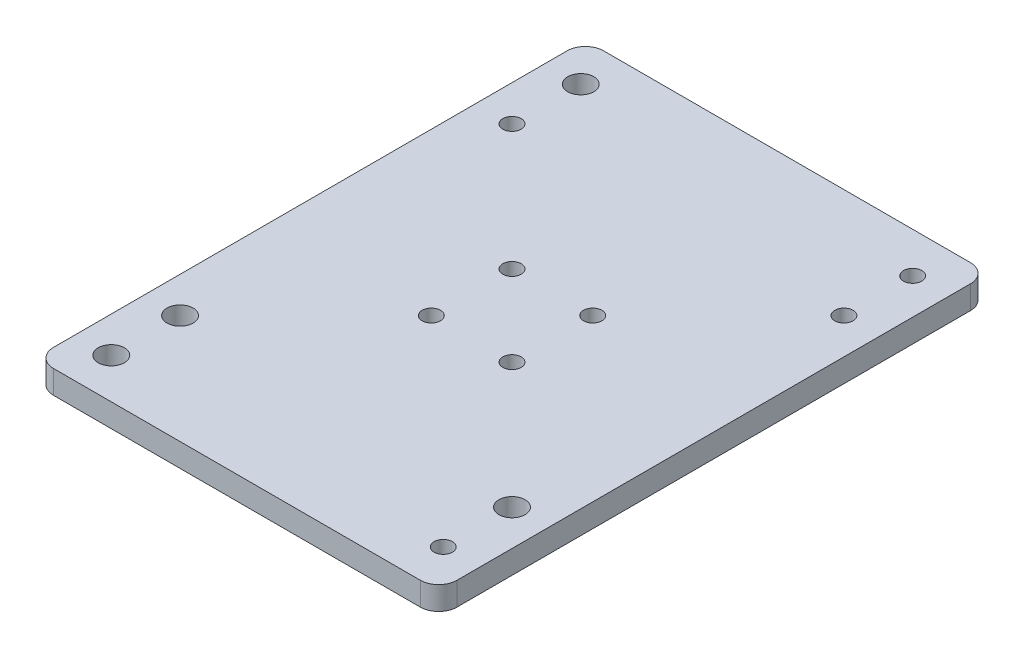
ISO-10303-21;
HEADER;
FILE_DESCRIPTION(('STEP AP214'),'2;1');
FILE_NAME('part.step','',(''),(''),'','','');
FILE_SCHEMA(('AUTOMOTIVE_DESIGN { 1 0 10303 214 1 1 1 1 }'));
ENDSEC;
DATA;
#1=APPLICATION_CONTEXT('core data for automotive mechanical design processes');
#2=APPLICATION_PROTOCOL_DEFINITION('international standard','automotive_design',2000,#1);
#3=PRODUCT_CONTEXT('',#1,'mechanical');
#4=PRODUCT('Part','Part','',(#3));
#5=PRODUCT_RELATED_PRODUCT_CATEGORY('part','',(#4));
#6=PRODUCT_DEFINITION_FORMATION('','',#4);
#7=PRODUCT_DEFINITION_CONTEXT('part definition',#1,'design');
#8=PRODUCT_DEFINITION('design','',#6,#7);
#9=PRODUCT_DEFINITION_SHAPE('','',#8);
#10=(LENGTH_UNIT() NAMED_UNIT(*) SI_UNIT(.MILLI.,.METRE.));
#11=(NAMED_UNIT(*) PLANE_ANGLE_UNIT() SI_UNIT($,.RADIAN.));
#12=(NAMED_UNIT(*) SI_UNIT($,.STERADIAN.) SOLID_ANGLE_UNIT());
#13=UNCERTAINTY_MEASURE_WITH_UNIT(LENGTH_MEASURE(1.E-05),#10,'distance_accuracy_value','');
#14=(GEOMETRIC_REPRESENTATION_CONTEXT(3) GLOBAL_UNCERTAINTY_ASSIGNED_CONTEXT((#13)) GLOBAL_UNIT_ASSIGNED_CONTEXT((#10,
#11,#12)) REPRESENTATION_CONTEXT('',''));
#15=CARTESIAN_POINT('',(0.,0.,0.));
#16=DIRECTION('',(0.,0.,1.));
#17=DIRECTION('',(1.,0.,0.));
#18=AXIS2_PLACEMENT_3D('',#15,#16,#17);
#19=CARTESIAN_POINT('',(0.,6.35,0.));
#20=DIRECTION('',(0.,1.,0.));
#21=DIRECTION('',(0.,0.,1.));
#22=AXIS2_PLACEMENT_3D('',#19,#20,#21);
#23=PLANE('',#22);
#24=CARTESIAN_POINT('',(11.,6.35,11.));
#25=DIRECTION('',(0.,1.,0.));
#26=DIRECTION('',(0.,0.,1.));
#27=AXIS2_PLACEMENT_3D('',#24,#25,#26);
#28=CIRCLE('',#27,2.5);
#29=CARTESIAN_POINT('',(11.,6.35,13.5));
#30=VERTEX_POINT('',#29);
#31=EDGE_CURVE('E228',#30,#30,#28,.T.);
#32=ORIENTED_EDGE('',*,*,#31,.F.);
#33=EDGE_LOOP('',(#32));
#34=FACE_BOUND('',#33,.T.);
#35=CARTESIAN_POINT('',(-11.,6.35,-11.));
#36=DIRECTION('',(0.,1.,0.));
#37=DIRECTION('',(0.,0.,1.));
#38=AXIS2_PLACEMENT_3D('',#35,#36,#37);
#39=CIRCLE('',#38,2.5);
#40=CARTESIAN_POINT('',(-11.,6.35,-8.49999999999998));
#41=VERTEX_POINT('',#40);
#42=EDGE_CURVE('E216',#41,#41,#39,.T.);
#43=ORIENTED_EDGE('',*,*,#42,.F.);
#44=EDGE_LOOP('',(#43));
#45=FACE_BOUND('',#44,.T.);
#46=CARTESIAN_POINT('',(-45.25,6.35,-45.2499999999999));
#47=DIRECTION('',(0.,1.,0.));
#48=DIRECTION('',(0.,0.,1.));
#49=AXIS2_PLACEMENT_3D('',#46,#47,#48);
#50=CIRCLE('',#49,2.5);
#51=CARTESIAN_POINT('',(-45.25,6.35,-42.7499999999999));
#52=VERTEX_POINT('',#51);
#53=EDGE_CURVE('E204',#52,#52,#50,.T.);
#54=ORIENTED_EDGE('',*,*,#53,.F.);
#55=EDGE_LOOP('',(#54));
#56=FACE_BOUND('',#55,.T.);
#57=CARTESIAN_POINT('',(-45.25,6.35,45.25));
#58=DIRECTION('',(0.,1.,0.));
#59=DIRECTION('',(0.,0.,1.));
#60=AXIS2_PLACEMENT_3D('',#57,#58,#59);
#61=CIRCLE('',#60,3.55999999999983);
#62=CARTESIAN_POINT('',(-45.25,6.35,48.8099999999998));
#63=VERTEX_POINT('',#62);
#64=EDGE_CURVE('E192',#63,#63,#61,.T.);
#65=ORIENTED_EDGE('',*,*,#64,.F.);
#66=EDGE_LOOP('',(#65));
#67=FACE_BOUND('',#66,.T.);
#68=CARTESIAN_POINT('',(45.25,6.35,-64.));
#69=DIRECTION('',(0.,1.,0.));
#70=DIRECTION('',(0.,0.,1.));
#71=AXIS2_PLACEMENT_3D('',#68,#69,#70);
#72=CIRCLE('',#71,2.5);
#73=CARTESIAN_POINT('',(45.25,6.35,-61.5));
#74=VERTEX_POINT('',#73);
#75=EDGE_CURVE('E180',#74,#74,#72,.T.);
#76=ORIENTED_EDGE('',*,*,#75,.F.);
#77=EDGE_LOOP('',(#76));
#78=FACE_BOUND('',#77,.T.);
#79=CARTESIAN_POINT('',(-45.25,6.35,-64.));
#80=DIRECTION('',(0.,1.,0.));
#81=DIRECTION('',(0.,0.,1.));
#82=AXIS2_PLACEMENT_3D('',#79,#80,#81);
#83=CIRCLE('',#82,3.56);
#84=CARTESIAN_POINT('',(-45.25,6.35,-60.44));
#85=VERTEX_POINT('',#84);
#86=EDGE_CURVE('E163',#85,#85,#83,.T.);
#87=ORIENTED_EDGE('',*,*,#86,.F.);
#88=EDGE_LOOP('',(#87));
#89=FACE_BOUND('',#88,.T.);
#90=DIRECTION('',(0.,0.,-1.));
#91=VECTOR('',#90,1.);
#92=CARTESIAN_POINT('',(55.,6.35,75.));
#93=LINE('',#92,#91);
#94=CARTESIAN_POINT('',(55.,6.35,70.));
#95=VERTEX_POINT('',#94);
#96=CARTESIAN_POINT('',(55.,6.35,-70.));
#97=VERTEX_POINT('',#96);
#98=EDGE_CURVE('E170',#95,#97,#93,.T.);
#99=ORIENTED_EDGE('',*,*,#98,.T.);
#100=CARTESIAN_POINT('',(50.,6.35,-70.));
#101=DIRECTION('',(0.,1.,0.));
#102=DIRECTION('',(0.,0.,1.));
#103=AXIS2_PLACEMENT_3D('',#100,#101,#102);
#104=CIRCLE('',#103,5.);
#105=CARTESIAN_POINT('',(50.,6.35,-75.));
#106=VERTEX_POINT('',#105);
#107=EDGE_CURVE('E147',#97,#106,#104,.T.);
#108=ORIENTED_EDGE('',*,*,#107,.T.);
#109=DIRECTION('',(-1.,0.,0.));
#110=VECTOR('',#109,1.);
#111=CARTESIAN_POINT('',(55.,6.35,-75.));
#112=LINE('',#111,#110);
#113=CARTESIAN_POINT('',(-50.,6.35,-75.));
#114=VERTEX_POINT('',#113);
#115=EDGE_CURVE('E118',#106,#114,#112,.T.);
#116=ORIENTED_EDGE('',*,*,#115,.T.);
#117=CARTESIAN_POINT('',(-50.,6.35,-70.));
#118=DIRECTION('',(0.,1.,0.));
#119=DIRECTION('',(0.,0.,1.));
#120=AXIS2_PLACEMENT_3D('',#117,#118,#119);
#121=CIRCLE('',#120,5.);
#122=CARTESIAN_POINT('',(-55.,6.35,-70.));
#123=VERTEX_POINT('',#122);
#124=EDGE_CURVE('E142',#114,#123,#121,.T.);
#125=ORIENTED_EDGE('',*,*,#124,.T.);
#126=DIRECTION('',(0.,0.,1.));
#127=VECTOR('',#126,1.);
#128=CARTESIAN_POINT('',(-55.,6.35,75.));
#129=LINE('',#128,#127);
#130=CARTESIAN_POINT('',(-55.,6.35,70.));
#131=VERTEX_POINT('',#130);
#132=EDGE_CURVE('E125',#123,#131,#129,.T.);
#133=ORIENTED_EDGE('',*,*,#132,.T.);
#134=CARTESIAN_POINT('',(-50.,6.35,70.));
#135=DIRECTION('',(0.,1.,0.));
#136=DIRECTION('',(0.,0.,1.));
#137=AXIS2_PLACEMENT_3D('',#134,#135,#136);
#138=CIRCLE('',#137,5.);
#139=CARTESIAN_POINT('',(-50.,6.35,75.));
#140=VERTEX_POINT('',#139);
#141=EDGE_CURVE('E54',#131,#140,#138,.T.);
#142=ORIENTED_EDGE('',*,*,#141,.T.);
#143=DIRECTION('',(1.,0.,0.));
#144=VECTOR('',#143,1.);
#145=CARTESIAN_POINT('',(55.,6.35,75.));
#146=LINE('',#145,#144);
#147=CARTESIAN_POINT('',(50.,6.35,75.));
#148=VERTEX_POINT('',#147);
#149=EDGE_CURVE('E128',#140,#148,#146,.T.);
#150=ORIENTED_EDGE('',*,*,#149,.T.);
#151=CARTESIAN_POINT('',(50.,6.35,70.));
#152=DIRECTION('',(0.,1.,0.));
#153=DIRECTION('',(0.,0.,1.));
#154=AXIS2_PLACEMENT_3D('',#151,#152,#153);
#155=CIRCLE('',#154,5.);
#156=EDGE_CURVE('E145',#148,#95,#155,.T.);
#157=ORIENTED_EDGE('',*,*,#156,.T.);
#158=EDGE_LOOP('',(#99,#108,#116,#125,#133,#142,#150,#157));
#159=FACE_BOUND('',#158,.T.);
#160=CARTESIAN_POINT('',(-45.25,6.35,64.));
#161=DIRECTION('',(0.,1.,0.));
#162=DIRECTION('',(0.,0.,1.));
#163=AXIS2_PLACEMENT_3D('',#160,#161,#162);
#164=CIRCLE('',#163,3.56);
#165=CARTESIAN_POINT('',(-45.25,6.35,67.56));
#166=VERTEX_POINT('',#165);
#167=EDGE_CURVE('E175',#166,#166,#164,.T.);
#168=ORIENTED_EDGE('',*,*,#167,.F.);
#169=EDGE_LOOP('',(#168));
#170=FACE_BOUND('',#169,.T.);
#171=CARTESIAN_POINT('',(45.25,6.35,64.));
#172=DIRECTION('',(0.,1.,0.));
#173=DIRECTION('',(0.,0.,1.));
#174=AXIS2_PLACEMENT_3D('',#171,#172,#173);
#175=CIRCLE('',#174,2.5);
#176=CARTESIAN_POINT('',(45.25,6.35,66.5));
#177=VERTEX_POINT('',#176);
#178=EDGE_CURVE('E186',#177,#177,#175,.T.);
#179=ORIENTED_EDGE('',*,*,#178,.F.);
#180=EDGE_LOOP('',(#179));
#181=FACE_BOUND('',#180,.T.);
#182=CARTESIAN_POINT('',(45.25,6.35,45.25));
#183=DIRECTION('',(0.,1.,0.));
#184=DIRECTION('',(0.,0.,1.));
#185=AXIS2_PLACEMENT_3D('',#182,#183,#184);
#186=CIRCLE('',#185,3.55999999999997);
#187=CARTESIAN_POINT('',(45.25,6.35,48.8099999999999));
#188=VERTEX_POINT('',#187);
#189=EDGE_CURVE('E198',#188,#188,#186,.T.);
#190=ORIENTED_EDGE('',*,*,#189,.F.);
#191=EDGE_LOOP('',(#190));
#192=FACE_BOUND('',#191,.T.);
#193=CARTESIAN_POINT('',(45.25,6.35,-45.2499999999999));
#194=DIRECTION('',(0.,1.,0.));
#195=DIRECTION('',(0.,0.,1.));
#196=AXIS2_PLACEMENT_3D('',#193,#194,#195);
#197=CIRCLE('',#196,2.50000000000019);
#198=CARTESIAN_POINT('',(45.25,6.35,-42.7499999999997));
#199=VERTEX_POINT('',#198);
#200=EDGE_CURVE('E210',#199,#199,#197,.T.);
#201=ORIENTED_EDGE('',*,*,#200,.F.);
#202=EDGE_LOOP('',(#201));
#203=FACE_BOUND('',#202,.T.);
#204=CARTESIAN_POINT('',(11.,6.35,-11.));
#205=DIRECTION('',(0.,1.,0.));
#206=DIRECTION('',(0.,0.,1.));
#207=AXIS2_PLACEMENT_3D('',#204,#205,#206);
#208=CIRCLE('',#207,2.5);
#209=CARTESIAN_POINT('',(11.,6.35,-8.49999999999998));
#210=VERTEX_POINT('',#209);
#211=EDGE_CURVE('E222',#210,#210,#208,.T.);
#212=ORIENTED_EDGE('',*,*,#211,.F.);
#213=EDGE_LOOP('',(#212));
#214=FACE_BOUND('',#213,.T.);
#215=CARTESIAN_POINT('',(-11.,6.35,11.));
#216=DIRECTION('',(0.,1.,0.));
#217=DIRECTION('',(0.,0.,1.));
#218=AXIS2_PLACEMENT_3D('',#215,#216,#217);
#219=CIRCLE('',#218,2.5);
#220=CARTESIAN_POINT('',(-11.,6.35,13.5));
#221=VERTEX_POINT('',#220);
#222=EDGE_CURVE('E234',#221,#221,#219,.T.);
#223=ORIENTED_EDGE('',*,*,#222,.F.);
#224=EDGE_LOOP('',(#223));
#225=FACE_BOUND('',#224,.T.);
#226=ADVANCED_FACE('F32',(#34,#45,#56,#67,#78,#89,#159,#170,#181,#192,#203,#214,#225),#23,.T.);
#227=CARTESIAN_POINT('',(0.,0.,0.));
#228=DIRECTION('',(0.,1.,0.));
#229=DIRECTION('',(0.,0.,1.));
#230=AXIS2_PLACEMENT_3D('',#227,#228,#229);
#231=PLANE('',#230);
#232=CARTESIAN_POINT('',(11.,0.,11.));
#233=DIRECTION('',(0.,1.,0.));
#234=DIRECTION('',(0.,0.,1.));
#235=AXIS2_PLACEMENT_3D('',#232,#233,#234);
#236=CIRCLE('',#235,2.5);
#237=CARTESIAN_POINT('',(11.,0.,13.5));
#238=VERTEX_POINT('',#237);
#239=EDGE_CURVE('E231',#238,#238,#236,.T.);
#240=ORIENTED_EDGE('',*,*,#239,.T.);
#241=EDGE_LOOP('',(#240));
#242=FACE_BOUND('',#241,.T.);
#243=CARTESIAN_POINT('',(-11.,0.,-11.));
#244=DIRECTION('',(0.,1.,0.));
#245=DIRECTION('',(0.,0.,1.));
#246=AXIS2_PLACEMENT_3D('',#243,#244,#245);
#247=CIRCLE('',#246,2.5);
#248=CARTESIAN_POINT('',(-11.,0.,-8.49999999999998));
#249=VERTEX_POINT('',#248);
#250=EDGE_CURVE('E219',#249,#249,#247,.T.);
#251=ORIENTED_EDGE('',*,*,#250,.T.);
#252=EDGE_LOOP('',(#251));
#253=FACE_BOUND('',#252,.T.);
#254=CARTESIAN_POINT('',(-45.25,0.,-45.2499999999999));
#255=DIRECTION('',(0.,1.,0.));
#256=DIRECTION('',(0.,0.,1.));
#257=AXIS2_PLACEMENT_3D('',#254,#255,#256);
#258=CIRCLE('',#257,2.5);
#259=CARTESIAN_POINT('',(-45.25,0.,-42.7499999999999));
#260=VERTEX_POINT('',#259);
#261=EDGE_CURVE('E207',#260,#260,#258,.T.);
#262=ORIENTED_EDGE('',*,*,#261,.T.);
#263=EDGE_LOOP('',(#262));
#264=FACE_BOUND('',#263,.T.);
#265=CARTESIAN_POINT('',(-45.25,0.,45.25));
#266=DIRECTION('',(0.,1.,0.));
#267=DIRECTION('',(0.,0.,1.));
#268=AXIS2_PLACEMENT_3D('',#265,#266,#267);
#269=CIRCLE('',#268,3.55999999999983);
#270=CARTESIAN_POINT('',(-45.25,0.,48.8099999999998));
#271=VERTEX_POINT('',#270);
#272=EDGE_CURVE('E195',#271,#271,#269,.T.);
#273=ORIENTED_EDGE('',*,*,#272,.T.);
#274=EDGE_LOOP('',(#273));
#275=FACE_BOUND('',#274,.T.);
#276=CARTESIAN_POINT('',(45.25,0.,-64.));
#277=DIRECTION('',(0.,1.,0.));
#278=DIRECTION('',(0.,0.,1.));
#279=AXIS2_PLACEMENT_3D('',#276,#277,#278);
#280=CIRCLE('',#279,2.5);
#281=CARTESIAN_POINT('',(45.25,0.,-61.5));
#282=VERTEX_POINT('',#281);
#283=EDGE_CURVE('E183',#282,#282,#280,.T.);
#284=ORIENTED_EDGE('',*,*,#283,.T.);
#285=EDGE_LOOP('',(#284));
#286=FACE_BOUND('',#285,.T.);
#287=CARTESIAN_POINT('',(-45.25,0.,-64.));
#288=DIRECTION('',(0.,1.,0.));
#289=DIRECTION('',(0.,0.,1.));
#290=AXIS2_PLACEMENT_3D('',#287,#288,#289);
#291=CIRCLE('',#290,3.56);
#292=CARTESIAN_POINT('',(-45.25,0.,-60.44));
#293=VERTEX_POINT('',#292);
#294=EDGE_CURVE('E166',#293,#293,#291,.T.);
#295=ORIENTED_EDGE('',*,*,#294,.T.);
#296=EDGE_LOOP('',(#295));
#297=FACE_BOUND('',#296,.T.);
#298=DIRECTION('',(-1.,0.,0.));
#299=VECTOR('',#298,1.);
#300=CARTESIAN_POINT('',(55.,0.,-75.));
#301=LINE('',#300,#299);
#302=CARTESIAN_POINT('',(50.,0.,-75.));
#303=VERTEX_POINT('',#302);
#304=CARTESIAN_POINT('',(-50.,0.,-75.));
#305=VERTEX_POINT('',#304);
#306=EDGE_CURVE('E115',#303,#305,#301,.T.);
#307=ORIENTED_EDGE('',*,*,#306,.F.);
#308=CARTESIAN_POINT('',(50.,0.,-70.));
#309=DIRECTION('',(0.,1.,0.));
#310=DIRECTION('',(0.,0.,1.));
#311=AXIS2_PLACEMENT_3D('',#308,#309,#310);
#312=CIRCLE('',#311,5.);
#313=CARTESIAN_POINT('',(55.,0.,-70.));
#314=VERTEX_POINT('',#313);
#315=EDGE_CURVE('E98',#303,#314,#312,.F.);
#316=ORIENTED_EDGE('',*,*,#315,.T.);
#317=DIRECTION('',(0.,0.,-1.));
#318=VECTOR('',#317,1.);
#319=CARTESIAN_POINT('',(55.,0.,75.));
#320=LINE('',#319,#318);
#321=CARTESIAN_POINT('',(55.,0.,70.));
#322=VERTEX_POINT('',#321);
#323=EDGE_CURVE('E126',#322,#314,#320,.T.);
#324=ORIENTED_EDGE('',*,*,#323,.F.);
#325=CARTESIAN_POINT('',(50.,0.,70.));
#326=DIRECTION('',(0.,1.,0.));
#327=DIRECTION('',(0.,0.,1.));
#328=AXIS2_PLACEMENT_3D('',#325,#326,#327);
#329=CIRCLE('',#328,5.);
#330=CARTESIAN_POINT('',(50.,0.,75.));
#331=VERTEX_POINT('',#330);
#332=EDGE_CURVE('E109',#322,#331,#329,.F.);
#333=ORIENTED_EDGE('',*,*,#332,.T.);
#334=DIRECTION('',(1.,0.,0.));
#335=VECTOR('',#334,1.);
#336=CARTESIAN_POINT('',(55.,0.,75.));
#337=LINE('',#336,#335);
#338=CARTESIAN_POINT('',(-50.,0.,75.));
#339=VERTEX_POINT('',#338);
#340=EDGE_CURVE('E130',#339,#331,#337,.T.);
#341=ORIENTED_EDGE('',*,*,#340,.F.);
#342=CARTESIAN_POINT('',(-50.,0.,70.));
#343=DIRECTION('',(0.,1.,0.));
#344=DIRECTION('',(0.,0.,1.));
#345=AXIS2_PLACEMENT_3D('',#342,#343,#344);
#346=CIRCLE('',#345,5.);
#347=CARTESIAN_POINT('',(-55.,0.,70.));
#348=VERTEX_POINT('',#347);
#349=EDGE_CURVE('E136',#339,#348,#346,.F.);
#350=ORIENTED_EDGE('',*,*,#349,.T.);
#351=DIRECTION('',(0.,0.,1.));
#352=VECTOR('',#351,1.);
#353=CARTESIAN_POINT('',(-55.,0.,75.));
#354=LINE('',#353,#352);
#355=CARTESIAN_POINT('',(-55.,0.,-70.));
#356=VERTEX_POINT('',#355);
#357=EDGE_CURVE('E158',#356,#348,#354,.T.);
#358=ORIENTED_EDGE('',*,*,#357,.F.);
#359=CARTESIAN_POINT('',(-50.,0.,-70.));
#360=DIRECTION('',(0.,1.,0.));
#361=DIRECTION('',(0.,0.,1.));
#362=AXIS2_PLACEMENT_3D('',#359,#360,#361);
#363=CIRCLE('',#362,5.);
#364=EDGE_CURVE('E119',#356,#305,#363,.F.);
#365=ORIENTED_EDGE('',*,*,#364,.T.);
#366=EDGE_LOOP('',(#307,#316,#324,#333,#341,#350,#358,#365));
#367=FACE_BOUND('',#366,.T.);
#368=CARTESIAN_POINT('',(-45.25,0.,64.));
#369=DIRECTION('',(0.,1.,0.));
#370=DIRECTION('',(0.,0.,1.));
#371=AXIS2_PLACEMENT_3D('',#368,#369,#370);
#372=CIRCLE('',#371,3.56);
#373=CARTESIAN_POINT('',(-45.25,0.,67.56));
#374=VERTEX_POINT('',#373);
#375=EDGE_CURVE('E177',#374,#374,#372,.T.);
#376=ORIENTED_EDGE('',*,*,#375,.T.);
#377=EDGE_LOOP('',(#376));
#378=FACE_BOUND('',#377,.T.);
#379=CARTESIAN_POINT('',(45.25,0.,64.));
#380=DIRECTION('',(0.,1.,0.));
#381=DIRECTION('',(0.,0.,1.));
#382=AXIS2_PLACEMENT_3D('',#379,#380,#381);
#383=CIRCLE('',#382,2.5);
#384=CARTESIAN_POINT('',(45.25,0.,66.5));
#385=VERTEX_POINT('',#384);
#386=EDGE_CURVE('E189',#385,#385,#383,.T.);
#387=ORIENTED_EDGE('',*,*,#386,.T.);
#388=EDGE_LOOP('',(#387));
#389=FACE_BOUND('',#388,.T.);
#390=CARTESIAN_POINT('',(45.25,0.,45.25));
#391=DIRECTION('',(0.,1.,0.));
#392=DIRECTION('',(0.,0.,1.));
#393=AXIS2_PLACEMENT_3D('',#390,#391,#392);
#394=CIRCLE('',#393,3.55999999999997);
#395=CARTESIAN_POINT('',(45.25,0.,48.8099999999999));
#396=VERTEX_POINT('',#395);
#397=EDGE_CURVE('E201',#396,#396,#394,.T.);
#398=ORIENTED_EDGE('',*,*,#397,.T.);
#399=EDGE_LOOP('',(#398));
#400=FACE_BOUND('',#399,.T.);
#401=CARTESIAN_POINT('',(45.25,0.,-45.2499999999999));
#402=DIRECTION('',(0.,1.,0.));
#403=DIRECTION('',(0.,0.,1.));
#404=AXIS2_PLACEMENT_3D('',#401,#402,#403);
#405=CIRCLE('',#404,2.50000000000019);
#406=CARTESIAN_POINT('',(45.25,0.,-42.7499999999997));
#407=VERTEX_POINT('',#406);
#408=EDGE_CURVE('E213',#407,#407,#405,.T.);
#409=ORIENTED_EDGE('',*,*,#408,.T.);
#410=EDGE_LOOP('',(#409));
#411=FACE_BOUND('',#410,.T.);
#412=CARTESIAN_POINT('',(11.,0.,-11.));
#413=DIRECTION('',(0.,1.,0.));
#414=DIRECTION('',(0.,0.,1.));
#415=AXIS2_PLACEMENT_3D('',#412,#413,#414);
#416=CIRCLE('',#415,2.5);
#417=CARTESIAN_POINT('',(11.,0.,-8.49999999999998));
#418=VERTEX_POINT('',#417);
#419=EDGE_CURVE('E225',#418,#418,#416,.T.);
#420=ORIENTED_EDGE('',*,*,#419,.T.);
#421=EDGE_LOOP('',(#420));
#422=FACE_BOUND('',#421,.T.);
#423=CARTESIAN_POINT('',(-11.,0.,11.));
#424=DIRECTION('',(0.,1.,0.));
#425=DIRECTION('',(0.,0.,1.));
#426=AXIS2_PLACEMENT_3D('',#423,#424,#425);
#427=CIRCLE('',#426,2.5);
#428=CARTESIAN_POINT('',(-11.,0.,13.5));
#429=VERTEX_POINT('',#428);
#430=EDGE_CURVE('E237',#429,#429,#427,.T.);
#431=ORIENTED_EDGE('',*,*,#430,.T.);
#432=EDGE_LOOP('',(#431));
#433=FACE_BOUND('',#432,.T.);
#434=ADVANCED_FACE('F122',(#242,#253,#264,#275,#286,#297,#367,#378,#389,#400,#411,#422,#433),
#231,.F.);
#435=CARTESIAN_POINT('',(-55.,6.35,75.));
#436=DIRECTION('',(1.,0.,0.));
#437=DIRECTION('',(0.,0.,-1.));
#438=AXIS2_PLACEMENT_3D('',#435,#436,#437);
#439=PLANE('',#438);
#440=ORIENTED_EDGE('',*,*,#357,.T.);
#441=DIRECTION('',(0.,-1.,0.));
#442=VECTOR('',#441,1.);
#443=CARTESIAN_POINT('',(-55.,6.35,70.));
#444=LINE('',#443,#442);
#445=EDGE_CURVE('E11',#348,#131,#444,.F.);
#446=ORIENTED_EDGE('',*,*,#445,.T.);
#447=ORIENTED_EDGE('',*,*,#132,.F.);
#448=DIRECTION('',(0.,-1.,0.));
#449=VECTOR('',#448,1.);
#450=CARTESIAN_POINT('',(-55.,6.35,-70.));
#451=LINE('',#450,#449);
#452=EDGE_CURVE('E40',#123,#356,#451,.T.);
#453=ORIENTED_EDGE('',*,*,#452,.T.);
#454=EDGE_LOOP('',(#440,#446,#447,#453));
#455=FACE_BOUND('',#454,.T.);
#456=ADVANCED_FACE('F157',(#455),#439,.F.);
#457=CARTESIAN_POINT('',(55.,6.35,75.));
#458=DIRECTION('',(0.,0.,-1.));
#459=DIRECTION('',(-1.,0.,0.));
#460=AXIS2_PLACEMENT_3D('',#457,#458,#459);
#461=PLANE('',#460);
#462=ORIENTED_EDGE('',*,*,#340,.T.);
#463=DIRECTION('',(0.,-1.,0.));
#464=VECTOR('',#463,1.);
#465=CARTESIAN_POINT('',(50.,6.35,75.));
#466=LINE('',#465,#464);
#467=EDGE_CURVE('E47',#331,#148,#466,.F.);
#468=ORIENTED_EDGE('',*,*,#467,.T.);
#469=ORIENTED_EDGE('',*,*,#149,.F.);
#470=DIRECTION('',(0.,-1.,0.));
#471=VECTOR('',#470,1.);
#472=CARTESIAN_POINT('',(-50.,6.35,75.));
#473=LINE('',#472,#471);
#474=EDGE_CURVE('E149',#140,#339,#473,.T.);
#475=ORIENTED_EDGE('',*,*,#474,.T.);
#476=EDGE_LOOP('',(#462,#468,#469,#475));
#477=FACE_BOUND('',#476,.T.);
#478=ADVANCED_FACE('F265',(#477),#461,.F.);
#479=CARTESIAN_POINT('',(55.,6.35,75.));
#480=DIRECTION('',(-1.,0.,0.));
#481=DIRECTION('',(0.,0.,1.));
#482=AXIS2_PLACEMENT_3D('',#479,#480,#481);
#483=PLANE('',#482);
#484=ORIENTED_EDGE('',*,*,#323,.T.);
#485=DIRECTION('',(0.,-1.,0.));
#486=VECTOR('',#485,1.);
#487=CARTESIAN_POINT('',(55.,6.35,-70.));
#488=LINE('',#487,#486);
#489=EDGE_CURVE('E103',#314,#97,#488,.F.);
#490=ORIENTED_EDGE('',*,*,#489,.T.);
#491=ORIENTED_EDGE('',*,*,#98,.F.);
#492=DIRECTION('',(0.,-1.,0.));
#493=VECTOR('',#492,1.);
#494=CARTESIAN_POINT('',(55.,6.35,70.));
#495=LINE('',#494,#493);
#496=EDGE_CURVE('E108',#95,#322,#495,.T.);
#497=ORIENTED_EDGE('',*,*,#496,.T.);
#498=EDGE_LOOP('',(#484,#490,#491,#497));
#499=FACE_BOUND('',#498,.T.);
#500=ADVANCED_FACE('F262',(#499),#483,.F.);
#501=CARTESIAN_POINT('',(55.,6.35,-75.));
#502=DIRECTION('',(0.,0.,1.));
#503=DIRECTION('',(1.,0.,0.));
#504=AXIS2_PLACEMENT_3D('',#501,#502,#503);
#505=PLANE('',#504);
#506=ORIENTED_EDGE('',*,*,#115,.F.);
#507=DIRECTION('',(0.,-1.,0.));
#508=VECTOR('',#507,1.);
#509=CARTESIAN_POINT('',(50.,6.35,-75.));
#510=LINE('',#509,#508);
#511=EDGE_CURVE('E102',#106,#303,#510,.T.);
#512=ORIENTED_EDGE('',*,*,#511,.T.);
#513=ORIENTED_EDGE('',*,*,#306,.T.);
#514=DIRECTION('',(0.,-1.,0.));
#515=VECTOR('',#514,1.);
#516=CARTESIAN_POINT('',(-50.,6.35,-75.));
#517=LINE('',#516,#515);
#518=EDGE_CURVE('E120',#305,#114,#517,.F.);
#519=ORIENTED_EDGE('',*,*,#518,.T.);
#520=EDGE_LOOP('',(#506,#512,#513,#519));
#521=FACE_BOUND('',#520,.T.);
#522=ADVANCED_FACE('F114',(#521),#505,.F.);
#523=CARTESIAN_POINT('',(-45.25,6.35,-64.));
#524=DIRECTION('',(0.,-1.,0.));
#525=DIRECTION('',(0.,0.,-1.));
#526=AXIS2_PLACEMENT_3D('',#523,#524,#525);
#527=CYLINDRICAL_SURFACE('',#526,3.56);
#528=ORIENTED_EDGE('',*,*,#86,.T.);
#529=EDGE_LOOP('',(#528));
#530=FACE_BOUND('',#529,.T.);
#531=ORIENTED_EDGE('',*,*,#294,.F.);
#532=EDGE_LOOP('',(#531));
#533=FACE_BOUND('',#532,.T.);
#534=ADVANCED_FACE('F257',(#530,#533),#527,.F.);
#535=CARTESIAN_POINT('',(-45.25,6.35,64.));
#536=DIRECTION('',(0.,-1.,0.));
#537=DIRECTION('',(0.,0.,-1.));
#538=AXIS2_PLACEMENT_3D('',#535,#536,#537);
#539=CYLINDRICAL_SURFACE('',#538,3.56);
#540=ORIENTED_EDGE('',*,*,#167,.T.);
#541=EDGE_LOOP('',(#540));
#542=FACE_BOUND('',#541,.T.);
#543=ORIENTED_EDGE('',*,*,#375,.F.);
#544=EDGE_LOOP('',(#543));
#545=FACE_BOUND('',#544,.T.);
#546=ADVANCED_FACE('F340',(#542,#545),#539,.F.);
#547=CARTESIAN_POINT('',(45.25,6.35,-64.));
#548=DIRECTION('',(0.,-1.,0.));
#549=DIRECTION('',(0.,0.,-1.));
#550=AXIS2_PLACEMENT_3D('',#547,#548,#549);
#551=CYLINDRICAL_SURFACE('',#550,2.5);
#552=ORIENTED_EDGE('',*,*,#75,.T.);
#553=EDGE_LOOP('',(#552));
#554=FACE_BOUND('',#553,.T.);
#555=ORIENTED_EDGE('',*,*,#283,.F.);
#556=EDGE_LOOP('',(#555));
#557=FACE_BOUND('',#556,.T.);
#558=ADVANCED_FACE('F337',(#554,#557),#551,.F.);
#559=CARTESIAN_POINT('',(45.25,6.35,64.));
#560=DIRECTION('',(0.,-1.,0.));
#561=DIRECTION('',(0.,0.,-1.));
#562=AXIS2_PLACEMENT_3D('',#559,#560,#561);
#563=CYLINDRICAL_SURFACE('',#562,2.5);
#564=ORIENTED_EDGE('',*,*,#178,.T.);
#565=EDGE_LOOP('',(#564));
#566=FACE_BOUND('',#565,.T.);
#567=ORIENTED_EDGE('',*,*,#386,.F.);
#568=EDGE_LOOP('',(#567));
#569=FACE_BOUND('',#568,.T.);
#570=ADVANCED_FACE('F333',(#566,#569),#563,.F.);
#571=CARTESIAN_POINT('',(-45.25,6.35,45.25));
#572=DIRECTION('',(0.,-1.,0.));
#573=DIRECTION('',(0.,0.,-1.));
#574=AXIS2_PLACEMENT_3D('',#571,#572,#573);
#575=CYLINDRICAL_SURFACE('',#574,3.55999999999983);
#576=ORIENTED_EDGE('',*,*,#64,.T.);
#577=EDGE_LOOP('',(#576));
#578=FACE_BOUND('',#577,.T.);
#579=ORIENTED_EDGE('',*,*,#272,.F.);
#580=EDGE_LOOP('',(#579));
#581=FACE_BOUND('',#580,.T.);
#582=ADVANCED_FACE('F329',(#578,#581),#575,.F.);
#583=CARTESIAN_POINT('',(45.25,6.35,45.25));
#584=DIRECTION('',(0.,-1.,0.));
#585=DIRECTION('',(0.,0.,-1.));
#586=AXIS2_PLACEMENT_3D('',#583,#584,#585);
#587=CYLINDRICAL_SURFACE('',#586,3.55999999999997);
#588=ORIENTED_EDGE('',*,*,#189,.T.);
#589=EDGE_LOOP('',(#588));
#590=FACE_BOUND('',#589,.T.);
#591=ORIENTED_EDGE('',*,*,#397,.F.);
#592=EDGE_LOOP('',(#591));
#593=FACE_BOUND('',#592,.T.);
#594=ADVANCED_FACE('F325',(#590,#593),#587,.F.);
#595=CARTESIAN_POINT('',(-45.25,6.35,-45.2499999999999));
#596=DIRECTION('',(0.,-1.,0.));
#597=DIRECTION('',(0.,0.,-1.));
#598=AXIS2_PLACEMENT_3D('',#595,#596,#597);
#599=CYLINDRICAL_SURFACE('',#598,2.5);
#600=ORIENTED_EDGE('',*,*,#53,.T.);
#601=EDGE_LOOP('',(#600));
#602=FACE_BOUND('',#601,.T.);
#603=ORIENTED_EDGE('',*,*,#261,.F.);
#604=EDGE_LOOP('',(#603));
#605=FACE_BOUND('',#604,.T.);
#606=ADVANCED_FACE('F321',(#602,#605),#599,.F.);
#607=CARTESIAN_POINT('',(45.25,6.35,-45.2499999999999));
#608=DIRECTION('',(0.,-1.,0.));
#609=DIRECTION('',(0.,0.,-1.));
#610=AXIS2_PLACEMENT_3D('',#607,#608,#609);
#611=CYLINDRICAL_SURFACE('',#610,2.50000000000019);
#612=ORIENTED_EDGE('',*,*,#200,.T.);
#613=EDGE_LOOP('',(#612));
#614=FACE_BOUND('',#613,.T.);
#615=ORIENTED_EDGE('',*,*,#408,.F.);
#616=EDGE_LOOP('',(#615));
#617=FACE_BOUND('',#616,.T.);
#618=ADVANCED_FACE('F317',(#614,#617),#611,.F.);
#619=CARTESIAN_POINT('',(-11.,6.35,-11.));
#620=DIRECTION('',(0.,-1.,0.));
#621=DIRECTION('',(0.,0.,-1.));
#622=AXIS2_PLACEMENT_3D('',#619,#620,#621);
#623=CYLINDRICAL_SURFACE('',#622,2.5);
#624=ORIENTED_EDGE('',*,*,#42,.T.);
#625=EDGE_LOOP('',(#624));
#626=FACE_BOUND('',#625,.T.);
#627=ORIENTED_EDGE('',*,*,#250,.F.);
#628=EDGE_LOOP('',(#627));
#629=FACE_BOUND('',#628,.T.);
#630=ADVANCED_FACE('F301',(#626,#629),#623,.F.);
#631=CARTESIAN_POINT('',(11.,6.35,-11.));
#632=DIRECTION('',(0.,-1.,0.));
#633=DIRECTION('',(0.,0.,-1.));
#634=AXIS2_PLACEMENT_3D('',#631,#632,#633);
#635=CYLINDRICAL_SURFACE('',#634,2.5);
#636=ORIENTED_EDGE('',*,*,#211,.T.);
#637=EDGE_LOOP('',(#636));
#638=FACE_BOUND('',#637,.T.);
#639=ORIENTED_EDGE('',*,*,#419,.F.);
#640=EDGE_LOOP('',(#639));
#641=FACE_BOUND('',#640,.T.);
#642=ADVANCED_FACE('F297',(#638,#641),#635,.F.);
#643=CARTESIAN_POINT('',(11.,6.35,11.));
#644=DIRECTION('',(0.,-1.,0.));
#645=DIRECTION('',(0.,0.,-1.));
#646=AXIS2_PLACEMENT_3D('',#643,#644,#645);
#647=CYLINDRICAL_SURFACE('',#646,2.5);
#648=ORIENTED_EDGE('',*,*,#31,.T.);
#649=EDGE_LOOP('',(#648));
#650=FACE_BOUND('',#649,.T.);
#651=ORIENTED_EDGE('',*,*,#239,.F.);
#652=EDGE_LOOP('',(#651));
#653=FACE_BOUND('',#652,.T.);
#654=ADVANCED_FACE('F300',(#650,#653),#647,.F.);
#655=CARTESIAN_POINT('',(-11.,6.35,11.));
#656=DIRECTION('',(0.,-1.,0.));
#657=DIRECTION('',(0.,0.,-1.));
#658=AXIS2_PLACEMENT_3D('',#655,#656,#657);
#659=CYLINDRICAL_SURFACE('',#658,2.5);
#660=ORIENTED_EDGE('',*,*,#222,.T.);
#661=EDGE_LOOP('',(#660));
#662=FACE_BOUND('',#661,.T.);
#663=ORIENTED_EDGE('',*,*,#430,.F.);
#664=EDGE_LOOP('',(#663));
#665=FACE_BOUND('',#664,.T.);
#666=ADVANCED_FACE('F243',(#662,#665),#659,.F.);
#667=CARTESIAN_POINT('',(50.,6.35,-70.));
#668=DIRECTION('',(0.,-1.,0.));
#669=DIRECTION('',(0.,0.,-1.));
#670=AXIS2_PLACEMENT_3D('',#667,#668,#669);
#671=CYLINDRICAL_SURFACE('',#670,5.);
#672=ORIENTED_EDGE('',*,*,#107,.F.);
#673=ORIENTED_EDGE('',*,*,#489,.F.);
#674=ORIENTED_EDGE('',*,*,#315,.F.);
#675=ORIENTED_EDGE('',*,*,#511,.F.);
#676=EDGE_LOOP('',(#672,#673,#674,#675));
#677=FACE_BOUND('',#676,.T.);
#678=ADVANCED_FACE('F101',(#677),#671,.T.);
#679=CARTESIAN_POINT('',(50.,6.35,70.));
#680=DIRECTION('',(0.,-1.,0.));
#681=DIRECTION('',(0.,0.,-1.));
#682=AXIS2_PLACEMENT_3D('',#679,#680,#681);
#683=CYLINDRICAL_SURFACE('',#682,5.);
#684=ORIENTED_EDGE('',*,*,#156,.F.);
#685=ORIENTED_EDGE('',*,*,#467,.F.);
#686=ORIENTED_EDGE('',*,*,#332,.F.);
#687=ORIENTED_EDGE('',*,*,#496,.F.);
#688=EDGE_LOOP('',(#684,#685,#686,#687));
#689=FACE_BOUND('',#688,.T.);
#690=ADVANCED_FACE('F273',(#689),#683,.T.);
#691=CARTESIAN_POINT('',(-50.,6.35,70.));
#692=DIRECTION('',(0.,-1.,0.));
#693=DIRECTION('',(0.,0.,-1.));
#694=AXIS2_PLACEMENT_3D('',#691,#692,#693);
#695=CYLINDRICAL_SURFACE('',#694,5.);
#696=ORIENTED_EDGE('',*,*,#141,.F.);
#697=ORIENTED_EDGE('',*,*,#445,.F.);
#698=ORIENTED_EDGE('',*,*,#349,.F.);
#699=ORIENTED_EDGE('',*,*,#474,.F.);
#700=EDGE_LOOP('',(#696,#697,#698,#699));
#701=FACE_BOUND('',#700,.T.);
#702=ADVANCED_FACE('F275',(#701),#695,.T.);
#703=CARTESIAN_POINT('',(-50.,6.35,-70.));
#704=DIRECTION('',(0.,-1.,0.));
#705=DIRECTION('',(0.,0.,-1.));
#706=AXIS2_PLACEMENT_3D('',#703,#704,#705);
#707=CYLINDRICAL_SURFACE('',#706,5.);
#708=ORIENTED_EDGE('',*,*,#124,.F.);
#709=ORIENTED_EDGE('',*,*,#518,.F.);
#710=ORIENTED_EDGE('',*,*,#364,.F.);
#711=ORIENTED_EDGE('',*,*,#452,.F.);
#712=EDGE_LOOP('',(#708,#709,#710,#711));
#713=FACE_BOUND('',#712,.T.);
#714=ADVANCED_FACE('F34',(#713),#707,.T.);
#715=CLOSED_SHELL('',(#226,#434,#456,#478,#500,#522,#534,#546,#558,#570,#582,#594,#606,#618,
#630,#642,#654,#666,#678,#690,#702,#714));
#716=MANIFOLD_SOLID_BREP('B2',#715);
#717=ADVANCED_BREP_SHAPE_REPRESENTATION('',(#18,#716),#14);
#718=SHAPE_DEFINITION_REPRESENTATION(#9,#717);
ENDSEC;
END-ISO-10303-21;
